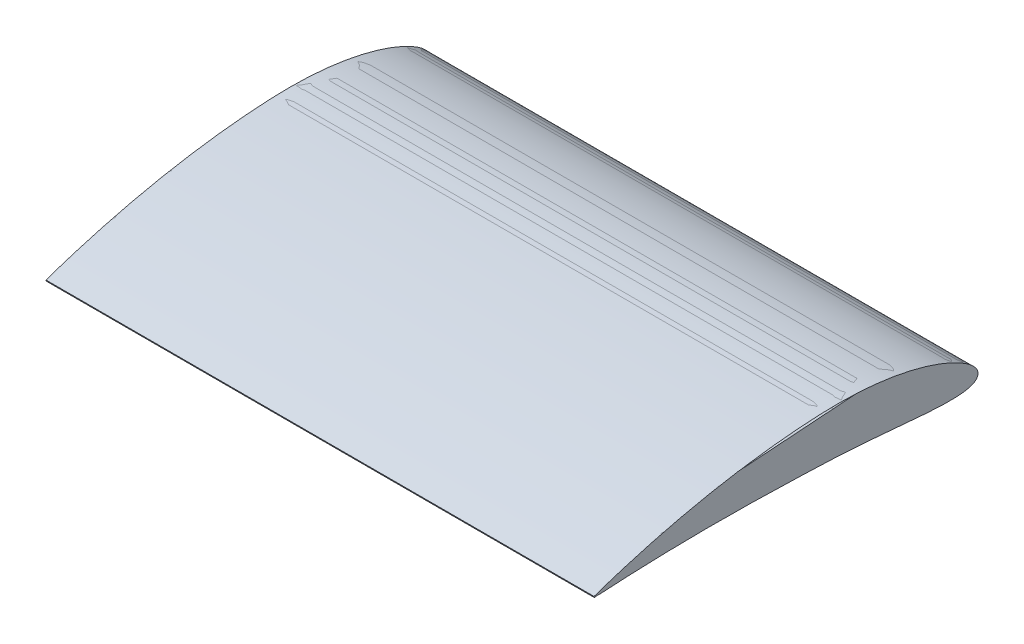
ISO-10303-21;
HEADER;
FILE_DESCRIPTION(('STEP AP214'),'2;1');
FILE_NAME('part.step','',(''),(''),'','','');
FILE_SCHEMA(('AUTOMOTIVE_DESIGN { 1 0 10303 214 1 1 1 1 }'));
ENDSEC;
DATA;
#1=APPLICATION_CONTEXT('core data for automotive mechanical design processes');
#2=APPLICATION_PROTOCOL_DEFINITION('international standard','automotive_design',2000,#1);
#3=PRODUCT_CONTEXT('',#1,'mechanical');
#4=PRODUCT('Part','Part','',(#3));
#5=PRODUCT_RELATED_PRODUCT_CATEGORY('part','',(#4));
#6=PRODUCT_DEFINITION_FORMATION('','',#4);
#7=PRODUCT_DEFINITION_CONTEXT('part definition',#1,'design');
#8=PRODUCT_DEFINITION('design','',#6,#7);
#9=PRODUCT_DEFINITION_SHAPE('','',#8);
#10=(LENGTH_UNIT() NAMED_UNIT(*) SI_UNIT(.MILLI.,.METRE.));
#11=(NAMED_UNIT(*) PLANE_ANGLE_UNIT() SI_UNIT($,.RADIAN.));
#12=(NAMED_UNIT(*) SI_UNIT($,.STERADIAN.) SOLID_ANGLE_UNIT());
#13=UNCERTAINTY_MEASURE_WITH_UNIT(LENGTH_MEASURE(1.E-05),#10,'distance_accuracy_value','');
#14=(GEOMETRIC_REPRESENTATION_CONTEXT(3) GLOBAL_UNCERTAINTY_ASSIGNED_CONTEXT((#13)) GLOBAL_UNIT_ASSIGNED_CONTEXT((#10,
#11,#12)) REPRESENTATION_CONTEXT('',''));
#15=CARTESIAN_POINT('',(0.,0.,0.));
#16=DIRECTION('',(0.,0.,1.));
#17=DIRECTION('',(1.,0.,0.));
#18=AXIS2_PLACEMENT_3D('',#15,#16,#17);
#19=CARTESIAN_POINT('',(-254.,-0.0431321443900543,354.886743616797));
#20=CARTESIAN_POINT('',(-254.,-0.178279335017485,354.878804644501));
#21=CARTESIAN_POINT('',(-254.,-0.392167923023726,354.877800433398));
#22=CARTESIAN_POINT('',(-254.,-0.620573956131464,354.718790465222));
#23=CARTESIAN_POINT('',(-254.,-0.699431404888376,354.471117086139));
#24=CARTESIAN_POINT('',(-254.,-0.643391604614161,354.133565704868));
#25=CARTESIAN_POINT('',(-254.,-0.459361570220994,353.534718925284));
#26=CARTESIAN_POINT('',(-254.,-0.324844179542978,352.878616178941));
#27=CARTESIAN_POINT('',(-254.,-0.27514866058284,352.169529456319));
#28=CARTESIAN_POINT('',(-254.,-0.291364997161076,351.509080841357));
#29=CARTESIAN_POINT('',(-254.,-0.345792204322244,350.641754644194));
#30=CARTESIAN_POINT('',(-254.,-0.343114155746738,349.495155440037));
#31=CARTESIAN_POINT('',(-254.,-0.249421828721012,348.057709575748));
#32=CARTESIAN_POINT('',(-254.,-0.0683409139707036,346.09921367213));
#33=CARTESIAN_POINT('',(-254.,0.118397326762072,343.684829350942));
#34=CARTESIAN_POINT('',(-254.,0.246984364997534,340.852436226817));
#35=CARTESIAN_POINT('',(-254.,0.367249929772089,338.020999346115));
#36=CARTESIAN_POINT('',(-254.,0.511580201986155,335.168021523029));
#37=CARTESIAN_POINT('',(-254.,0.714636978192544,331.352247356491));
#38=CARTESIAN_POINT('',(-254.,0.954928724606601,326.586197895792));
#39=CARTESIAN_POINT('',(-254.,1.20681195225131,320.88144930632));
#40=CARTESIAN_POINT('',(-254.,1.4473300056571,315.170675093735));
#41=CARTESIAN_POINT('',(-254.,1.67257875389077,309.456624124699));
#42=CARTESIAN_POINT('',(-254.,1.87730273842811,303.742775876454));
#43=CARTESIAN_POINT('',(-254.,2.12372376162243,296.124627961158));
#44=CARTESIAN_POINT('',(-254.,2.39172835372233,286.600178357651));
#45=CARTESIAN_POINT('',(-254.,2.63795629291167,275.168693373375));
#46=CARTESIAN_POINT('',(-254.,2.80252002889444,263.735979270128));
#47=CARTESIAN_POINT('',(-254.,2.89686079810874,252.302341578548));
#48=CARTESIAN_POINT('',(-254.,2.92556966555313,237.057017739622));
#49=CARTESIAN_POINT('',(-254.,2.77937112569216,218.000758012457));
#50=CARTESIAN_POINT('',(-254.,2.34538736185869,195.136294847587));
#51=CARTESIAN_POINT('',(-254.,1.80135309644542,176.087168980662));
#52=CARTESIAN_POINT('',(-254.,1.27469711910108,160.850436224513));
#53=CARTESIAN_POINT('',(-254.,0.757519293384525,145.613201917085));
#54=CARTESIAN_POINT('',(-254.,-0.0488647393760955,126.573365315217));
#55=CARTESIAN_POINT('',(-254.,-1.37544137231911,107.563138919971));
#56=CARTESIAN_POINT('',(-254.,-2.62781678175332,92.3688742568962));
#57=CARTESIAN_POINT('',(-254.,-3.6300548372849,80.9785899080022));
#58=CARTESIAN_POINT('',(-254.,-4.65595537981645,69.590216516382));
#59=CARTESIAN_POINT('',(-254.,-5.65786319372925,58.1991462892872));
#60=CARTESIAN_POINT('',(-254.,-6.41437981224258,48.6990829317655));
#61=CARTESIAN_POINT('',(-254.,-6.91222731474488,41.0906052218664));
#62=CARTESIAN_POINT('',(-254.,-7.21160877146256,35.379234272906));
#63=CARTESIAN_POINT('',(-254.,-7.40932183564488,29.6624563206879));
#64=CARTESIAN_POINT('',(-254.,-7.46425179444419,23.9414429696426));
#65=CARTESIAN_POINT('',(-254.,-7.30798707313279,18.2203220241415));
#66=CARTESIAN_POINT('',(-254.,-6.9197556334194,13.4587607781288));
#67=CARTESIAN_POINT('',(-254.,-6.33050106461964,9.68187611695184));
#68=CARTESIAN_POINT('',(-254.,-5.6940297470881,6.88512122340968));
#69=CARTESIAN_POINT('',(-254.,-4.7762987938631,4.14270319792107));
#70=CARTESIAN_POINT('',(-254.,-3.41757820307539,1.577222389026));
#71=CARTESIAN_POINT('',(-254.,-1.55951143606703,-0.143098612522162));
#72=CARTESIAN_POINT('',(-254.,0.27334805736061,-0.852938138221397));
#73=CARTESIAN_POINT('',(-254.,1.74964451434994,-0.959702576159667));
#74=CARTESIAN_POINT('',(-254.,3.22540437268725,-0.734728016148001));
#75=CARTESIAN_POINT('',(-254.,5.05905962123868,-0.0801726152191487));
#76=CARTESIAN_POINT('',(-254.,7.1001212162409,1.24439324956485));
#77=CARTESIAN_POINT('',(-254.,9.26941260174496,3.14063277116925));
#78=CARTESIAN_POINT('',(-254.,11.8748798112987,5.9467721548671));
#79=CARTESIAN_POINT('',(-254.,14.742035881579,9.77578941990615));
#80=CARTESIAN_POINT('',(-254.,17.7675222960399,14.6454674593734));
#81=CARTESIAN_POINT('',(-254.,20.4843822656892,19.6856425336971));
#82=CARTESIAN_POINT('',(-254.,22.9519540316381,24.8508878619448));
#83=CARTESIAN_POINT('',(-254.,25.9544130672521,31.8675816038441));
#84=CARTESIAN_POINT('',(-254.,29.2404948994926,40.824113666365));
#85=CARTESIAN_POINT('',(-254.,32.5620061255901,51.7773444999431));
#86=CARTESIAN_POINT('',(-254.,35.3318793771696,62.8814351731684));
#87=CARTESIAN_POINT('',(-254.,37.594417698218,74.0988563765813));
#88=CARTESIAN_POINT('',(-254.,39.9794755331792,89.1681202127049));
#89=CARTESIAN_POINT('',(-254.,41.8637677422164,108.154229954747));
#90=CARTESIAN_POINT('',(-254.,42.4798429209608,131.039776119875));
#91=CARTESIAN_POINT('',(-254.,41.5864789099038,153.906158518146));
#92=CARTESIAN_POINT('',(-254.,39.8271836936583,176.714275569098));
#93=CARTESIAN_POINT('',(-254.,37.3011907170268,199.450230249336));
#94=CARTESIAN_POINT('',(-254.,32.9445456132408,229.639462395631));
#95=CARTESIAN_POINT('',(-254.,25.7747866483641,267.096515494306));
#96=CARTESIAN_POINT('',(-254.,16.4649919660654,304.078052972751));
#97=CARTESIAN_POINT('',(-254.,7.76743874974292,333.311697469308));
#98=CARTESIAN_POINT('',(-254.,2.95972002225229,347.783593070607));
#99=CARTESIAN_POINT('',(-254.,0.4764541588744,354.991498919874));
#100=B_SPLINE_CURVE_WITH_KNOTS('',3,(#19,#20,#21,#22,#23,#24,#25,#26,#27,#28,#29,#30,#31,#32,
#33,#34,#35,#36,#37,#38,#39,#40,#41,#42,#43,#44,#45,#46,#47,#48,#49,#50,#51,#52,#53,#54,#55,#56,
#57,#58,#59,#60,#61,#62,#63,#64,#65,#66,#67,#68,#69,#70,#71,#72,#73,#74,#75,#76,#77,#78,#79,#80,
#81,#82,#83,#84,#85,#86,#87,#88,#89,#90,#91,#92,#93,#94,#95,#96,#97,#98,#99),.UNSPECIFIED.,.F.,
.F.,(4,1,1,1,1,1,1,1,1,1,1,1,1,1,1,1,1,1,1,1,1,1,1,1,1,1,1,1,1,1,1,1,1,1,1,1,1,1,1,1,1,1,1,1,1,
1,1,1,1,1,1,1,1,1,1,1,1,1,1,1,1,1,1,1,1,1,1,1,1,1,1,1,1,1,1,1,1,1,4),(-0.000119615790120337,
0.000368719796214317,0.000612887589381588,0.00085705538254886,0.0013453909688834,
0.00183372655521795,0.00281039772788714,0.00378706890055634,0.00476374007322542,
0.00574041124589462,0.0076937535912329,0.00964709593657119,0.0116004382819095,0.015507122972586,
0.0194138076632626,0.0233204923539393,0.027227177044616,0.0311338617352925,0.0389472311166458,
0.046760600497999,0.0545739698793522,0.0623873392607055,0.0702007086420587,0.078014078023412,
0.0936408167861184,0.109267555548825,0.124894294311531,0.140521033074238,0.156147771836944,
0.187401249362357,0.21865472688777,0.249908204413183,0.26553494317589,0.281161681938596,
0.312415159464009,0.343668636989422,0.359295375752128,0.374922114514835,0.390548853277541,
0.406175592040248,0.421802330802954,0.429615700184307,0.437429069565661,0.445242438947014,
0.453055808328367,0.46086917770972,0.468682547091074,0.47258923178175,0.476495916472427,
0.480402601163104,0.48430928585378,0.488215970544457,0.490169312889795,0.492122655235133,
0.494075997580471,0.49602933992581,0.499936024616486,0.503842709307163,0.50774939399784,
0.515562763379193,0.523376132760546,0.531189502141899,0.539002871523253,0.546816240904606,
0.562442979667312,0.578069718430019,0.593696457192725,0.609323195955432,0.624949934718138,
0.656203412243551,0.687456889768964,0.718710367294377,0.74996384481979,0.781217322345203,
0.812470799870616,0.874977754921442,0.937484709972267,0.96873818749768,0.999991665023093),.UNSPECIFIED.);
#101=DIRECTION('',(1.,0.,0.));
#102=VECTOR('',#101,1.);
#103=SURFACE_OF_LINEAR_EXTRUSION('',#100,#102);
#104=DIRECTION('',(1.,0.,0.));
#105=VECTOR('',#104,1.);
#106=CARTESIAN_POINT('',(-254.,0.4764541588744,354.991498919874));
#107=LINE('',#106,#105);
#108=CARTESIAN_POINT('',(-254.,0.4764541588744,354.991498919874));
#109=VERTEX_POINT('',#108);
#110=CARTESIAN_POINT('',(254.,0.4764541588744,354.991498919874));
#111=VERTEX_POINT('',#110);
#112=EDGE_CURVE('E42',#109,#111,#107,.T.);
#113=ORIENTED_EDGE('',*,*,#112,.T.);
#114=CARTESIAN_POINT('',(254.,-0.0431321443900543,354.886743616797));
#115=CARTESIAN_POINT('',(254.,-0.178279335017485,354.878804644501));
#116=CARTESIAN_POINT('',(254.,-0.392167923023726,354.877800433398));
#117=CARTESIAN_POINT('',(254.,-0.620573956131464,354.718790465222));
#118=CARTESIAN_POINT('',(254.,-0.699431404888376,354.471117086139));
#119=CARTESIAN_POINT('',(254.,-0.643391604614161,354.133565704868));
#120=CARTESIAN_POINT('',(254.,-0.459361570220994,353.534718925284));
#121=CARTESIAN_POINT('',(254.,-0.324844179542978,352.878616178941));
#122=CARTESIAN_POINT('',(254.,-0.27514866058284,352.169529456319));
#123=CARTESIAN_POINT('',(254.,-0.291364997161076,351.509080841357));
#124=CARTESIAN_POINT('',(254.,-0.345792204322244,350.641754644194));
#125=CARTESIAN_POINT('',(254.,-0.343114155746738,349.495155440037));
#126=CARTESIAN_POINT('',(254.,-0.249421828721012,348.057709575748));
#127=CARTESIAN_POINT('',(254.,-0.0683409139707036,346.09921367213));
#128=CARTESIAN_POINT('',(254.,0.118397326762072,343.684829350942));
#129=CARTESIAN_POINT('',(254.,0.246984364997534,340.852436226817));
#130=CARTESIAN_POINT('',(254.,0.367249929772089,338.020999346115));
#131=CARTESIAN_POINT('',(254.,0.511580201986155,335.168021523029));
#132=CARTESIAN_POINT('',(254.,0.714636978192544,331.352247356491));
#133=CARTESIAN_POINT('',(254.,0.954928724606601,326.586197895792));
#134=CARTESIAN_POINT('',(254.,1.20681195225131,320.88144930632));
#135=CARTESIAN_POINT('',(254.,1.4473300056571,315.170675093735));
#136=CARTESIAN_POINT('',(254.,1.67257875389077,309.456624124699));
#137=CARTESIAN_POINT('',(254.,1.87730273842811,303.742775876454));
#138=CARTESIAN_POINT('',(254.,2.12372376162243,296.124627961158));
#139=CARTESIAN_POINT('',(254.,2.39172835372233,286.600178357651));
#140=CARTESIAN_POINT('',(254.,2.63795629291167,275.168693373375));
#141=CARTESIAN_POINT('',(254.,2.80252002889444,263.735979270128));
#142=CARTESIAN_POINT('',(254.,2.89686079810874,252.302341578548));
#143=CARTESIAN_POINT('',(254.,2.92556966555313,237.057017739622));
#144=CARTESIAN_POINT('',(254.,2.77937112569216,218.000758012457));
#145=CARTESIAN_POINT('',(254.,2.34538736185869,195.136294847587));
#146=CARTESIAN_POINT('',(254.,1.80135309644542,176.087168980662));
#147=CARTESIAN_POINT('',(254.,1.27469711910108,160.850436224513));
#148=CARTESIAN_POINT('',(254.,0.757519293384525,145.613201917085));
#149=CARTESIAN_POINT('',(254.,-0.0488647393760955,126.573365315217));
#150=CARTESIAN_POINT('',(254.,-1.37544137231911,107.563138919971));
#151=CARTESIAN_POINT('',(254.,-2.62781678175332,92.3688742568962));
#152=CARTESIAN_POINT('',(254.,-3.6300548372849,80.9785899080022));
#153=CARTESIAN_POINT('',(254.,-4.65595537981645,69.590216516382));
#154=CARTESIAN_POINT('',(254.,-5.65786319372925,58.1991462892872));
#155=CARTESIAN_POINT('',(254.,-6.41437981224258,48.6990829317655));
#156=CARTESIAN_POINT('',(254.,-6.91222731474488,41.0906052218664));
#157=CARTESIAN_POINT('',(254.,-7.21160877146256,35.379234272906));
#158=CARTESIAN_POINT('',(254.,-7.40932183564488,29.6624563206879));
#159=CARTESIAN_POINT('',(254.,-7.46425179444419,23.9414429696426));
#160=CARTESIAN_POINT('',(254.,-7.30798707313279,18.2203220241415));
#161=CARTESIAN_POINT('',(254.,-6.9197556334194,13.4587607781288));
#162=CARTESIAN_POINT('',(254.,-6.33050106461964,9.68187611695184));
#163=CARTESIAN_POINT('',(254.,-5.6940297470881,6.88512122340968));
#164=CARTESIAN_POINT('',(254.,-4.7762987938631,4.14270319792107));
#165=CARTESIAN_POINT('',(254.,-3.41757820307539,1.577222389026));
#166=CARTESIAN_POINT('',(254.,-1.55951143606703,-0.143098612522162));
#167=CARTESIAN_POINT('',(254.,0.27334805736061,-0.852938138221397));
#168=CARTESIAN_POINT('',(254.,1.74964451434994,-0.959702576159667));
#169=CARTESIAN_POINT('',(254.,3.22540437268725,-0.734728016148001));
#170=CARTESIAN_POINT('',(254.,5.05905962123868,-0.0801726152191487));
#171=CARTESIAN_POINT('',(254.,7.1001212162409,1.24439324956485));
#172=CARTESIAN_POINT('',(254.,9.26941260174496,3.14063277116925));
#173=CARTESIAN_POINT('',(254.,11.8748798112987,5.9467721548671));
#174=CARTESIAN_POINT('',(254.,14.742035881579,9.77578941990615));
#175=CARTESIAN_POINT('',(254.,17.7675222960399,14.6454674593734));
#176=CARTESIAN_POINT('',(254.,20.4843822656892,19.6856425336971));
#177=CARTESIAN_POINT('',(254.,22.9519540316381,24.8508878619448));
#178=CARTESIAN_POINT('',(254.,25.9544130672521,31.8675816038441));
#179=CARTESIAN_POINT('',(254.,29.2404948994926,40.824113666365));
#180=CARTESIAN_POINT('',(254.,32.5620061255901,51.7773444999431));
#181=CARTESIAN_POINT('',(254.,35.3318793771696,62.8814351731684));
#182=CARTESIAN_POINT('',(254.,37.594417698218,74.0988563765813));
#183=CARTESIAN_POINT('',(254.,39.9794755331792,89.1681202127049));
#184=CARTESIAN_POINT('',(254.,41.8637677422164,108.154229954747));
#185=CARTESIAN_POINT('',(254.,42.4798429209608,131.039776119875));
#186=CARTESIAN_POINT('',(254.,41.5864789099038,153.906158518146));
#187=CARTESIAN_POINT('',(254.,39.8271836936583,176.714275569098));
#188=CARTESIAN_POINT('',(254.,37.3011907170268,199.450230249336));
#189=CARTESIAN_POINT('',(254.,32.9445456132408,229.639462395631));
#190=CARTESIAN_POINT('',(254.,25.7747866483641,267.096515494306));
#191=CARTESIAN_POINT('',(254.,16.4649919660654,304.078052972751));
#192=CARTESIAN_POINT('',(254.,7.76743874974292,333.311697469308));
#193=CARTESIAN_POINT('',(254.,2.95972002225229,347.783593070607));
#194=CARTESIAN_POINT('',(254.,0.4764541588744,354.991498919874));
#195=B_SPLINE_CURVE_WITH_KNOTS('',3,(#114,#115,#116,#117,#118,#119,#120,#121,#122,#123,#124,
#125,#126,#127,#128,#129,#130,#131,#132,#133,#134,#135,#136,#137,#138,#139,#140,#141,#142,#143,
#144,#145,#146,#147,#148,#149,#150,#151,#152,#153,#154,#155,#156,#157,#158,#159,#160,#161,#162,
#163,#164,#165,#166,#167,#168,#169,#170,#171,#172,#173,#174,#175,#176,#177,#178,#179,#180,#181,
#182,#183,#184,#185,#186,#187,#188,#189,#190,#191,#192,#193,#194),.UNSPECIFIED.,.F.,.F.,(4,1,1,
1,1,1,1,1,1,1,1,1,1,1,1,1,1,1,1,1,1,1,1,1,1,1,1,1,1,1,1,1,1,1,1,1,1,1,1,1,1,1,1,1,1,1,1,1,1,1,1,
1,1,1,1,1,1,1,1,1,1,1,1,1,1,1,1,1,1,1,1,1,1,1,1,1,1,1,4),(-0.000119615790120337,
0.000368719796214317,0.000612887589381588,0.00085705538254886,0.0013453909688834,
0.00183372655521795,0.00281039772788714,0.00378706890055634,0.00476374007322542,
0.00574041124589462,0.0076937535912329,0.00964709593657119,0.0116004382819095,0.015507122972586,
0.0194138076632626,0.0233204923539393,0.027227177044616,0.0311338617352925,0.0389472311166458,
0.046760600497999,0.0545739698793522,0.0623873392607055,0.0702007086420587,0.078014078023412,
0.0936408167861184,0.109267555548825,0.124894294311531,0.140521033074238,0.156147771836944,
0.187401249362357,0.21865472688777,0.249908204413183,0.26553494317589,0.281161681938596,
0.312415159464009,0.343668636989422,0.359295375752128,0.374922114514835,0.390548853277541,
0.406175592040248,0.421802330802954,0.429615700184307,0.437429069565661,0.445242438947014,
0.453055808328367,0.46086917770972,0.468682547091074,0.47258923178175,0.476495916472427,
0.480402601163104,0.48430928585378,0.488215970544457,0.490169312889795,0.492122655235133,
0.494075997580471,0.49602933992581,0.499936024616486,0.503842709307163,0.50774939399784,
0.515562763379193,0.523376132760546,0.531189502141899,0.539002871523253,0.546816240904606,
0.562442979667312,0.578069718430019,0.593696457192725,0.609323195955432,0.624949934718138,
0.656203412243551,0.687456889768964,0.718710367294377,0.74996384481979,0.781217322345203,
0.812470799870616,0.874977754921442,0.937484709972267,0.96873818749768,0.999991665023093),.UNSPECIFIED.);
#196=CARTESIAN_POINT('',(254.,-0.0431321443900543,354.886743616797));
#197=VERTEX_POINT('',#196);
#198=EDGE_CURVE('E91',#197,#111,#195,.T.);
#199=ORIENTED_EDGE('',*,*,#198,.F.);
#200=DIRECTION('',(1.,0.,0.));
#201=VECTOR('',#200,1.);
#202=CARTESIAN_POINT('',(-254.,-0.0431321443900543,354.886743616797));
#203=LINE('',#202,#201);
#204=CARTESIAN_POINT('',(-254.,-0.0431321443900543,354.886743616797));
#205=VERTEX_POINT('',#204);
#206=EDGE_CURVE('E11',#205,#197,#203,.T.);
#207=ORIENTED_EDGE('',*,*,#206,.F.);
#208=EDGE_CURVE('E85',#205,#109,#100,.T.);
#209=ORIENTED_EDGE('',*,*,#208,.T.);
#210=EDGE_LOOP('',(#113,#199,#207,#209));
#211=FACE_BOUND('',#210,.T.);
#212=ADVANCED_FACE('F38',(#211),#103,.T.);
#213=CARTESIAN_POINT('',(-254.,-0.0431321443900543,354.886743616797));
#214=DIRECTION('',(0.,-0.197636177725578,0.980275441523465));
#215=DIRECTION('',(0.,-0.980275441523465,-0.197636177725578));
#216=AXIS2_PLACEMENT_3D('',#213,#214,#215);
#217=PLANE('',#216);
#218=ORIENTED_EDGE('',*,*,#206,.T.);
#219=DIRECTION('',(0.,-0.980275441523465,-0.197636177725578));
#220=VECTOR('',#219,1.);
#221=CARTESIAN_POINT('',(254.,-0.0431321443900543,354.886743616797));
#222=LINE('',#221,#220);
#223=EDGE_CURVE('E105',#111,#197,#222,.T.);
#224=ORIENTED_EDGE('',*,*,#223,.F.);
#225=ORIENTED_EDGE('',*,*,#112,.F.);
#226=DIRECTION('',(0.,-0.980275441523465,-0.197636177725578));
#227=VECTOR('',#226,1.);
#228=CARTESIAN_POINT('',(-254.,-0.0431321443900543,354.886743616797));
#229=LINE('',#228,#227);
#230=EDGE_CURVE('E136',#109,#205,#229,.T.);
#231=ORIENTED_EDGE('',*,*,#230,.T.);
#232=EDGE_LOOP('',(#218,#224,#225,#231));
#233=FACE_BOUND('',#232,.T.);
#234=ADVANCED_FACE('F126',(#233),#217,.T.);
#235=CARTESIAN_POINT('',(-254.,7.05345746149114,1.29551999687546));
#236=DIRECTION('',(1.,0.,0.));
#237=DIRECTION('',(0.,0.,-1.));
#238=AXIS2_PLACEMENT_3D('',#235,#236,#237);
#239=PLANE('',#238);
#240=DIRECTION('',(0.,-0.980275441523261,-0.197636177726589));
#241=VECTOR('',#240,1.);
#242=CARTESIAN_POINT('',(-254.,-0.030257196476355,354.787327227915));
#243=LINE('',#242,#241);
#244=CARTESIAN_POINT('',(-254.,0.410417886541196,354.876173010782));
#245=VERTEX_POINT('',#244);
#246=CARTESIAN_POINT('',(-254.,-0.0302571964763479,354.787327227915));
#247=VERTEX_POINT('',#246);
#248=EDGE_CURVE('E115',#245,#247,#243,.T.);
#249=ORIENTED_EDGE('',*,*,#248,.T.);
#250=CARTESIAN_POINT('',(-254.,-0.0302571964763549,354.787327227915));
#251=CARTESIAN_POINT('',(-254.,-0.202511549774369,354.777220058735));
#252=CARTESIAN_POINT('',(-254.,-0.758116619532224,354.744619463571));
#253=CARTESIAN_POINT('',(-254.,-0.0353878265544988,352.780150329408));
#254=CARTESIAN_POINT('',(-254.,-0.406394891328532,350.227621537646));
#255=CARTESIAN_POINT('',(-254.,0.191518705423128,345.076973542852));
#256=CARTESIAN_POINT('',(-254.,0.426846954997304,338.388880463138));
#257=CARTESIAN_POINT('',(-254.,0.912902226587254,329.767358245601));
#258=CARTESIAN_POINT('',(-254.,1.37107480853054,319.513378005819));
#259=CARTESIAN_POINT('',(-254.,1.85212662662604,307.681856469284));
#260=CARTESIAN_POINT('',(-254.,2.2828903737653,294.437996631764));
#261=CARTESIAN_POINT('',(-254.,2.65636592644588,279.933149694368));
#262=CARTESIAN_POINT('',(-254.,2.90744759821903,264.337268620967));
#263=CARTESIAN_POINT('',(-254.,3.02848065946825,247.830237404837));
#264=CARTESIAN_POINT('',(-254.,2.97910623211237,224.541124113717));
#265=CARTESIAN_POINT('',(-254.,2.58624656268472,200.671973719441));
#266=CARTESIAN_POINT('',(-254.,1.91789319340299,176.483884619505));
#267=CARTESIAN_POINT('',(-254.,1.28674404323604,158.296467958687));
#268=CARTESIAN_POINT('',(-254.,0.674535202653767,140.48477689744));
#269=CARTESIAN_POINT('',(-254.,-0.458414507964394,117.937239158073));
#270=CARTESIAN_POINT('',(-254.,-2.15355585803942,96.4067365521407));
#271=CARTESIAN_POINT('',(-254.,-3.98391169785236,75.9298626432168));
#272=CARTESIAN_POINT('',(-254.,-5.23803481691952,61.9523939500743));
#273=CARTESIAN_POINT('',(-254.,-6.3018667845873,49.0830780174977));
#274=CARTESIAN_POINT('',(-254.,-7.05379709208437,37.4470572233417));
#275=CARTESIAN_POINT('',(-254.,-7.40487495085787,27.1638266260831));
#276=CARTESIAN_POINT('',(-254.,-7.26852765592077,18.3491197902741));
#277=CARTESIAN_POINT('',(-254.,-6.58746462442697,11.0873159681167));
#278=CARTESIAN_POINT('',(-254.,-5.28808573883758,5.4507808849597));
#279=CARTESIAN_POINT('',(-254.,-3.30894318563573,1.35108725963543));
#280=CARTESIAN_POINT('',(-254.,-0.148325215865237,-0.987487677240321));
#281=CARTESIAN_POINT('',(-254.,3.7967578133831,-0.765838064798878));
#282=CARTESIAN_POINT('',(-254.,7.71649979382027,1.67922407257184));
#283=CARTESIAN_POINT('',(-254.,11.8553419578337,5.92689766090299));
#284=CARTESIAN_POINT('',(-254.,16.2262899348965,12.1072031542234));
#285=CARTESIAN_POINT('',(-254.,20.7343193498453,20.187014187513));
#286=CARTESIAN_POINT('',(-254.,25.2201252971746,30.130463623116));
#287=CARTESIAN_POINT('',(-254.,29.5108543834638,41.8433907768923));
#288=CARTESIAN_POINT('',(-254.,33.4329059974258,55.1997604360673));
#289=CARTESIAN_POINT('',(-254.,36.8104805743368,70.0434509571498));
#290=CARTESIAN_POINT('',(-254.,39.4786761807971,86.1884085277303));
#291=CARTESIAN_POINT('',(-254.,41.32105063238,103.42216726238));
#292=CARTESIAN_POINT('',(-254.,42.2288581946823,121.516747473044));
#293=CARTESIAN_POINT('',(-254.,42.1113766684293,140.09669102153));
#294=CARTESIAN_POINT('',(-254.,41.1132128906756,158.902335219002));
#295=CARTESIAN_POINT('',(-254.,39.0904540579609,183.961657870227));
#296=CARTESIAN_POINT('',(-254.,36.0047557168601,208.774809212926));
#297=CARTESIAN_POINT('',(-254.,31.1455287976255,238.622276389231));
#298=CARTESIAN_POINT('',(-254.,26.6515697314507,261.175777938493));
#299=CARTESIAN_POINT('',(-254.,21.7242725259394,282.422876263721));
#300=CARTESIAN_POINT('',(-254.,17.1306006385399,300.598349456261));
#301=CARTESIAN_POINT('',(-254.,11.7988919274353,319.654473711953));
#302=CARTESIAN_POINT('',(-254.,6.72155114802005,336.024074691811));
#303=CARTESIAN_POINT('',(-254.,3.49779827393597,345.800950265157));
#304=CARTESIAN_POINT('',(-254.,1.92709586834348,350.478726649503));
#305=CARTESIAN_POINT('',(-254.,0.953557869568799,353.29965963041));
#306=CARTESIAN_POINT('',(-254.,0.519388000117919,354.559877308969));
#307=CARTESIAN_POINT('',(-254.,0.410417886541196,354.876173010782));
#308=B_SPLINE_CURVE_WITH_KNOTS('',3,(#250,#251,#252,#253,#254,#255,#256,#257,#258,#259,#260,
#261,#262,#263,#264,#265,#266,#267,#268,#269,#270,#271,#272,#273,#274,#275,#276,#277,#278,#279,
#280,#281,#282,#283,#284,#285,#286,#287,#288,#289,#290,#291,#292,#293,#294,#295,#296,#297,#298,
#299,#300,#301,#302,#303,#304,#305,#306,#307),.UNSPECIFIED.,.F.,.F.,(4,1,1,1,1,1,1,1,1,1,1,1,1,
1,1,1,1,1,1,1,1,1,1,1,1,1,1,1,1,1,1,1,1,1,1,1,1,1,1,1,1,1,1,1,1,1,1,1,1,1,1,1,1,1,1,4),(0.,
0.00061435602735338,0.00198160056276364,0.00606849911990259,0.0128259983002053,
0.0221600600259541,0.0339528411484215,0.0480573219049674,0.0643016527838605,0.0824806064748046,
0.102390013464696,0.123786894847983,0.146429707819126,0.170067604158041,0.219268231220122,
0.244299756437978,0.269272617042279,0.293879334559277,0.317367886846568,0.361825599196296,
0.382415541627446,0.401655123624231,0.419361860817184,0.435356743556399,0.44945739068769,
0.461534248286615,0.471483960270294,0.479298491667603,0.485175806315722,0.489815015537041,
0.49445371882196,0.500384211459872,0.508369297965653,0.518670584727767,0.531320006060474,
0.54625561026072,0.563345994084458,0.58242326585592,0.60328874622392,0.625720296766354,
0.649474912467889,0.674310012117921,0.699958821683972,0.725614899189679,0.751503233324799,
0.803021620411888,0.828087427427487,0.875472920842336,0.897280851310736,0.917503738861992,
0.952328750245583,0.978398030734231,0.987765198149775,0.994535224157492,0.998628423374974,1.),.UNSPECIFIED.);
#309=EDGE_CURVE('E53',#247,#245,#308,.T.);
#310=ORIENTED_EDGE('',*,*,#309,.T.);
#311=EDGE_LOOP('',(#249,#310));
#312=FACE_BOUND('',#311,.T.);
#313=ORIENTED_EDGE('',*,*,#208,.F.);
#314=ORIENTED_EDGE('',*,*,#230,.F.);
#315=EDGE_LOOP('',(#313,#314));
#316=FACE_BOUND('',#315,.T.);
#317=ADVANCED_FACE('F123',(#312,#316),#239,.F.);
#318=DIRECTION('',(1.,0.,0.));
#319=VECTOR('',#318,1.);
#320=SURFACE_OF_LINEAR_EXTRUSION('',#308,#319);
#321=DIRECTION('',(1.,0.,0.));
#322=VECTOR('',#321,1.);
#323=CARTESIAN_POINT('',(-254.,-0.030257196476355,354.787327227915));
#324=LINE('',#323,#322);
#325=CARTESIAN_POINT('',(254.,-0.030257196476355,354.787327227915));
#326=VERTEX_POINT('',#325);
#327=EDGE_CURVE('E76',#247,#326,#324,.T.);
#328=ORIENTED_EDGE('',*,*,#327,.T.);
#329=CARTESIAN_POINT('',(254.,-0.0302571964763549,354.787327227915));
#330=CARTESIAN_POINT('',(254.,-0.202511549774369,354.777220058735));
#331=CARTESIAN_POINT('',(254.,-0.758116619532224,354.744619463571));
#332=CARTESIAN_POINT('',(254.,-0.0353878265544988,352.780150329408));
#333=CARTESIAN_POINT('',(254.,-0.406394891328532,350.227621537646));
#334=CARTESIAN_POINT('',(254.,0.191518705423128,345.076973542852));
#335=CARTESIAN_POINT('',(254.,0.426846954997304,338.388880463138));
#336=CARTESIAN_POINT('',(254.,0.912902226587254,329.767358245601));
#337=CARTESIAN_POINT('',(254.,1.37107480853054,319.513378005819));
#338=CARTESIAN_POINT('',(254.,1.85212662662604,307.681856469284));
#339=CARTESIAN_POINT('',(254.,2.2828903737653,294.437996631764));
#340=CARTESIAN_POINT('',(254.,2.65636592644588,279.933149694368));
#341=CARTESIAN_POINT('',(254.,2.90744759821903,264.337268620967));
#342=CARTESIAN_POINT('',(254.,3.02848065946825,247.830237404837));
#343=CARTESIAN_POINT('',(254.,2.97910623211237,224.541124113717));
#344=CARTESIAN_POINT('',(254.,2.58624656268472,200.671973719441));
#345=CARTESIAN_POINT('',(254.,1.91789319340299,176.483884619505));
#346=CARTESIAN_POINT('',(254.,1.28674404323604,158.296467958687));
#347=CARTESIAN_POINT('',(254.,0.674535202653767,140.48477689744));
#348=CARTESIAN_POINT('',(254.,-0.458414507964394,117.937239158073));
#349=CARTESIAN_POINT('',(254.,-2.15355585803942,96.4067365521407));
#350=CARTESIAN_POINT('',(254.,-3.98391169785236,75.9298626432168));
#351=CARTESIAN_POINT('',(254.,-5.23803481691952,61.9523939500743));
#352=CARTESIAN_POINT('',(254.,-6.3018667845873,49.0830780174977));
#353=CARTESIAN_POINT('',(254.,-7.05379709208437,37.4470572233417));
#354=CARTESIAN_POINT('',(254.,-7.40487495085787,27.1638266260831));
#355=CARTESIAN_POINT('',(254.,-7.26852765592077,18.3491197902741));
#356=CARTESIAN_POINT('',(254.,-6.58746462442697,11.0873159681167));
#357=CARTESIAN_POINT('',(254.,-5.28808573883758,5.4507808849597));
#358=CARTESIAN_POINT('',(254.,-3.30894318563573,1.35108725963543));
#359=CARTESIAN_POINT('',(254.,-0.148325215865237,-0.987487677240321));
#360=CARTESIAN_POINT('',(254.,3.7967578133831,-0.765838064798878));
#361=CARTESIAN_POINT('',(254.,7.71649979382027,1.67922407257184));
#362=CARTESIAN_POINT('',(254.,11.8553419578337,5.92689766090299));
#363=CARTESIAN_POINT('',(254.,16.2262899348965,12.1072031542234));
#364=CARTESIAN_POINT('',(254.,20.7343193498453,20.187014187513));
#365=CARTESIAN_POINT('',(254.,25.2201252971746,30.130463623116));
#366=CARTESIAN_POINT('',(254.,29.5108543834638,41.8433907768923));
#367=CARTESIAN_POINT('',(254.,33.4329059974258,55.1997604360673));
#368=CARTESIAN_POINT('',(254.,36.8104805743368,70.0434509571498));
#369=CARTESIAN_POINT('',(254.,39.4786761807971,86.1884085277303));
#370=CARTESIAN_POINT('',(254.,41.32105063238,103.42216726238));
#371=CARTESIAN_POINT('',(254.,42.2288581946823,121.516747473044));
#372=CARTESIAN_POINT('',(254.,42.1113766684293,140.09669102153));
#373=CARTESIAN_POINT('',(254.,41.1132128906756,158.902335219002));
#374=CARTESIAN_POINT('',(254.,39.0904540579609,183.961657870227));
#375=CARTESIAN_POINT('',(254.,36.0047557168601,208.774809212926));
#376=CARTESIAN_POINT('',(254.,31.1455287976255,238.622276389231));
#377=CARTESIAN_POINT('',(254.,26.6515697314507,261.175777938493));
#378=CARTESIAN_POINT('',(254.,21.7242725259394,282.422876263721));
#379=CARTESIAN_POINT('',(254.,17.1306006385399,300.598349456261));
#380=CARTESIAN_POINT('',(254.,11.7988919274353,319.654473711953));
#381=CARTESIAN_POINT('',(254.,6.72155114802005,336.024074691811));
#382=CARTESIAN_POINT('',(254.,3.49779827393597,345.800950265157));
#383=CARTESIAN_POINT('',(254.,1.92709586834348,350.478726649503));
#384=CARTESIAN_POINT('',(254.,0.953557869568799,353.29965963041));
#385=CARTESIAN_POINT('',(254.,0.519388000117919,354.559877308969));
#386=CARTESIAN_POINT('',(254.,0.410417886541196,354.876173010782));
#387=B_SPLINE_CURVE_WITH_KNOTS('',3,(#329,#330,#331,#332,#333,#334,#335,#336,#337,#338,#339,
#340,#341,#342,#343,#344,#345,#346,#347,#348,#349,#350,#351,#352,#353,#354,#355,#356,#357,#358,
#359,#360,#361,#362,#363,#364,#365,#366,#367,#368,#369,#370,#371,#372,#373,#374,#375,#376,#377,
#378,#379,#380,#381,#382,#383,#384,#385,#386),.UNSPECIFIED.,.F.,.F.,(4,1,1,1,1,1,1,1,1,1,1,1,1,
1,1,1,1,1,1,1,1,1,1,1,1,1,1,1,1,1,1,1,1,1,1,1,1,1,1,1,1,1,1,1,1,1,1,1,1,1,1,1,1,1,1,4),(0.,
0.00061435602735338,0.00198160056276364,0.00606849911990259,0.0128259983002053,
0.0221600600259541,0.0339528411484215,0.0480573219049674,0.0643016527838605,0.0824806064748046,
0.102390013464696,0.123786894847983,0.146429707819126,0.170067604158041,0.219268231220122,
0.244299756437978,0.269272617042279,0.293879334559277,0.317367886846568,0.361825599196296,
0.382415541627446,0.401655123624231,0.419361860817184,0.435356743556399,0.44945739068769,
0.461534248286615,0.471483960270294,0.479298491667603,0.485175806315722,0.489815015537041,
0.49445371882196,0.500384211459872,0.508369297965653,0.518670584727767,0.531320006060474,
0.54625561026072,0.563345994084458,0.58242326585592,0.60328874622392,0.625720296766354,
0.649474912467889,0.674310012117921,0.699958821683972,0.725614899189679,0.751503233324799,
0.803021620411888,0.828087427427487,0.875472920842336,0.897280851310736,0.917503738861992,
0.952328750245583,0.978398030734231,0.987765198149775,0.994535224157492,0.998628423374974,1.),.UNSPECIFIED.);
#388=CARTESIAN_POINT('',(254.,0.410417886541205,354.876173010782));
#389=VERTEX_POINT('',#388);
#390=EDGE_CURVE('E80',#326,#389,#387,.T.);
#391=ORIENTED_EDGE('',*,*,#390,.T.);
#392=DIRECTION('',(1.,0.,0.));
#393=VECTOR('',#392,1.);
#394=CARTESIAN_POINT('',(-254.,0.410417886541196,354.876173010782));
#395=LINE('',#394,#393);
#396=EDGE_CURVE('E86',#245,#389,#395,.T.);
#397=ORIENTED_EDGE('',*,*,#396,.F.);
#398=ORIENTED_EDGE('',*,*,#309,.F.);
#399=EDGE_LOOP('',(#328,#391,#397,#398));
#400=FACE_BOUND('',#399,.T.);
#401=ADVANCED_FACE('F78',(#400),#320,.F.);
#402=CARTESIAN_POINT('',(-254.,-0.030257196476355,354.787327227915));
#403=DIRECTION('',(0.,-0.197636177726589,0.980275441523261));
#404=DIRECTION('',(0.,-0.980275441523261,-0.197636177726589));
#405=AXIS2_PLACEMENT_3D('',#402,#403,#404);
#406=PLANE('',#405);
#407=ORIENTED_EDGE('',*,*,#396,.T.);
#408=DIRECTION('',(0.,-0.980275441523261,-0.197636177726589));
#409=VECTOR('',#408,1.);
#410=CARTESIAN_POINT('',(254.,-0.030257196476355,354.787327227915));
#411=LINE('',#410,#409);
#412=EDGE_CURVE('E88',#389,#326,#411,.T.);
#413=ORIENTED_EDGE('',*,*,#412,.T.);
#414=ORIENTED_EDGE('',*,*,#327,.F.);
#415=ORIENTED_EDGE('',*,*,#248,.F.);
#416=EDGE_LOOP('',(#407,#413,#414,#415));
#417=FACE_BOUND('',#416,.T.);
#418=ADVANCED_FACE('F89',(#417),#406,.F.);
#419=CARTESIAN_POINT('',(254.,7.05345746149114,1.29551999687546));
#420=DIRECTION('',(1.,0.,0.));
#421=DIRECTION('',(0.,0.,-1.));
#422=AXIS2_PLACEMENT_3D('',#419,#420,#421);
#423=PLANE('',#422);
#424=ORIENTED_EDGE('',*,*,#198,.T.);
#425=ORIENTED_EDGE('',*,*,#223,.T.);
#426=EDGE_LOOP('',(#424,#425));
#427=FACE_BOUND('',#426,.T.);
#428=ORIENTED_EDGE('',*,*,#412,.F.);
#429=ORIENTED_EDGE('',*,*,#390,.F.);
#430=EDGE_LOOP('',(#428,#429));
#431=FACE_BOUND('',#430,.T.);
#432=ADVANCED_FACE('F93',(#427,#431),#423,.T.);
#433=CLOSED_SHELL('',(#212,#234,#317,#401,#418,#432));
#434=MANIFOLD_SOLID_BREP('B2',#433);
#435=ADVANCED_BREP_SHAPE_REPRESENTATION('',(#18,#434),#14);
#436=SHAPE_DEFINITION_REPRESENTATION(#9,#435);
ENDSEC;
END-ISO-10303-21;
